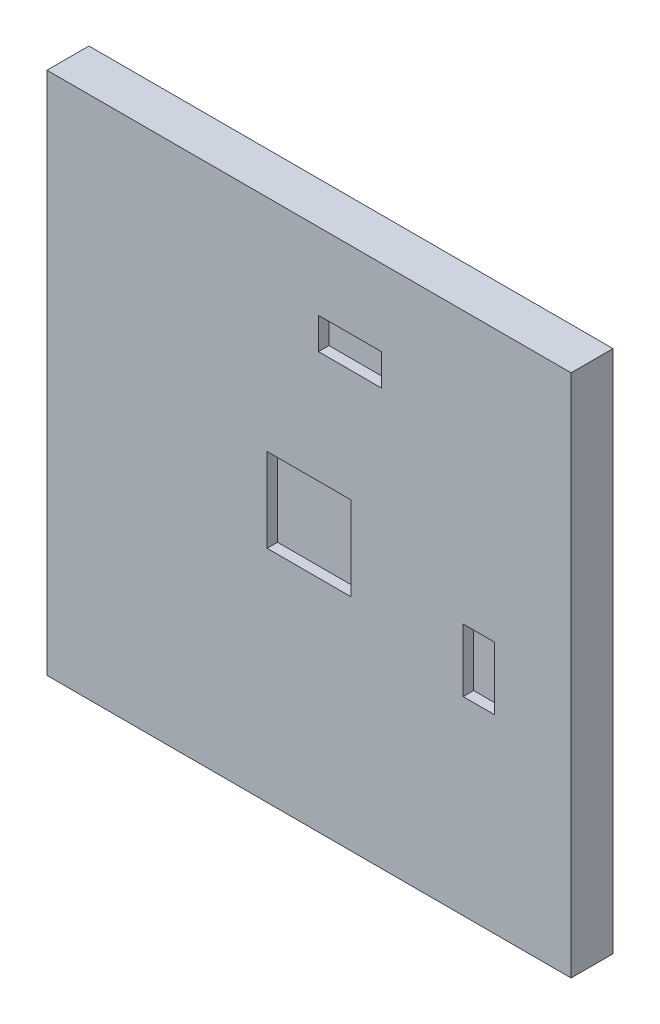
ISO-10303-21;
HEADER;
FILE_DESCRIPTION(('STEP AP214'),'2;1');
FILE_NAME('part.step','',(''),(''),'','','');
FILE_SCHEMA(('AUTOMOTIVE_DESIGN { 1 0 10303 214 1 1 1 1 }'));
ENDSEC;
DATA;
#1=APPLICATION_CONTEXT('core data for automotive mechanical design processes');
#2=APPLICATION_PROTOCOL_DEFINITION('international standard','automotive_design',2000,#1);
#3=PRODUCT_CONTEXT('',#1,'mechanical');
#4=PRODUCT('Part','Part','',(#3));
#5=PRODUCT_RELATED_PRODUCT_CATEGORY('part','',(#4));
#6=PRODUCT_DEFINITION_FORMATION('','',#4);
#7=PRODUCT_DEFINITION_CONTEXT('part definition',#1,'design');
#8=PRODUCT_DEFINITION('design','',#6,#7);
#9=PRODUCT_DEFINITION_SHAPE('','',#8);
#10=(LENGTH_UNIT() NAMED_UNIT(*) SI_UNIT(.MILLI.,.METRE.));
#11=(NAMED_UNIT(*) PLANE_ANGLE_UNIT() SI_UNIT($,.RADIAN.));
#12=(NAMED_UNIT(*) SI_UNIT($,.STERADIAN.) SOLID_ANGLE_UNIT());
#13=UNCERTAINTY_MEASURE_WITH_UNIT(LENGTH_MEASURE(1.E-05),#10,'distance_accuracy_value','');
#14=(GEOMETRIC_REPRESENTATION_CONTEXT(3) GLOBAL_UNCERTAINTY_ASSIGNED_CONTEXT((#13)) GLOBAL_UNIT_ASSIGNED_CONTEXT((#10,
#11,#12)) REPRESENTATION_CONTEXT('',''));
#15=CARTESIAN_POINT('',(0.,0.,0.));
#16=DIRECTION('',(0.,0.,1.));
#17=DIRECTION('',(1.,0.,0.));
#18=AXIS2_PLACEMENT_3D('',#15,#16,#17);
#19=CARTESIAN_POINT('',(0.,0.,20.));
#20=DIRECTION('',(0.,0.,1.));
#21=DIRECTION('',(1.,0.,0.));
#22=AXIS2_PLACEMENT_3D('',#19,#20,#21);
#23=PLANE('',#22);
#24=DIRECTION('',(-1.,0.,0.));
#25=VECTOR('',#24,1.);
#26=CARTESIAN_POINT('',(0.,17.5962921348315,20.));
#27=LINE('',#26,#25);
#28=CARTESIAN_POINT('',(56.5484076024617,17.5962921348315,20.));
#29=VERTEX_POINT('',#28);
#30=CARTESIAN_POINT('',(26.5484076024617,17.5962921348315,20.));
#31=VERTEX_POINT('',#30);
#32=EDGE_CURVE('E262',#29,#31,#27,.T.);
#33=ORIENTED_EDGE('',*,*,#32,.F.);
#34=DIRECTION('',(0.,-1.,0.));
#35=VECTOR('',#34,1.);
#36=CARTESIAN_POINT('',(56.5484076024617,0.,20.));
#37=LINE('',#36,#35);
#38=CARTESIAN_POINT('',(56.5484076024617,2.59629213483149,20.));
#39=VERTEX_POINT('',#38);
#40=EDGE_CURVE('E251',#29,#39,#37,.T.);
#41=ORIENTED_EDGE('',*,*,#40,.T.);
#42=DIRECTION('',(-1.,0.,0.));
#43=VECTOR('',#42,1.);
#44=CARTESIAN_POINT('',(0.,2.59629213483149,20.));
#45=LINE('',#44,#43);
#46=CARTESIAN_POINT('',(26.5484076024617,2.59629213483149,20.));
#47=VERTEX_POINT('',#46);
#48=EDGE_CURVE('E269',#39,#47,#45,.T.);
#49=ORIENTED_EDGE('',*,*,#48,.T.);
#50=DIRECTION('',(0.,-1.,0.));
#51=VECTOR('',#50,1.);
#52=CARTESIAN_POINT('',(26.5484076024617,0.,20.));
#53=LINE('',#52,#51);
#54=EDGE_CURVE('E265',#31,#47,#53,.T.);
#55=ORIENTED_EDGE('',*,*,#54,.F.);
#56=EDGE_LOOP('',(#33,#41,#49,#55));
#57=FACE_BOUND('',#56,.T.);
#58=DIRECTION('',(0.,1.,0.));
#59=VECTOR('',#58,1.);
#60=CARTESIAN_POINT('',(147.048407602462,-195.903707865169,20.));
#61=LINE('',#60,#59);
#62=CARTESIAN_POINT('',(147.048407602462,-195.903707865169,20.));
#63=VERTEX_POINT('',#62);
#64=CARTESIAN_POINT('',(147.048407602462,54.0962921348315,20.));
#65=VERTEX_POINT('',#64);
#66=EDGE_CURVE('E287',#63,#65,#61,.T.);
#67=ORIENTED_EDGE('',*,*,#66,.T.);
#68=DIRECTION('',(-1.,0.,0.));
#69=VECTOR('',#68,1.);
#70=CARTESIAN_POINT('',(147.048407602462,54.0962921348315,20.));
#71=LINE('',#70,#69);
#72=CARTESIAN_POINT('',(-102.951592397538,54.0962921348315,20.));
#73=VERTEX_POINT('',#72);
#74=EDGE_CURVE('E291',#65,#73,#71,.T.);
#75=ORIENTED_EDGE('',*,*,#74,.T.);
#76=DIRECTION('',(0.,-1.,0.));
#77=VECTOR('',#76,1.);
#78=CARTESIAN_POINT('',(-102.951592397538,-195.903707865169,20.));
#79=LINE('',#78,#77);
#80=CARTESIAN_POINT('',(-102.951592397538,-195.903707865169,20.));
#81=VERTEX_POINT('',#80);
#82=EDGE_CURVE('E295',#73,#81,#79,.T.);
#83=ORIENTED_EDGE('',*,*,#82,.T.);
#84=DIRECTION('',(1.,0.,0.));
#85=VECTOR('',#84,1.);
#86=CARTESIAN_POINT('',(147.048407602462,-195.903707865169,20.));
#87=LINE('',#86,#85);
#88=EDGE_CURVE('E298',#81,#63,#87,.T.);
#89=ORIENTED_EDGE('',*,*,#88,.T.);
#90=EDGE_LOOP('',(#67,#75,#83,#89));
#91=FACE_BOUND('',#90,.T.);
#92=DIRECTION('',(1.,0.,0.));
#93=VECTOR('',#92,1.);
#94=CARTESIAN_POINT('',(0.,-50.9037078651685,20.));
#95=LINE('',#94,#93);
#96=CARTESIAN_POINT('',(2.04840760246174,-50.9037078651685,20.));
#97=VERTEX_POINT('',#96);
#98=CARTESIAN_POINT('',(42.0484076024617,-50.9037078651685,20.));
#99=VERTEX_POINT('',#98);
#100=EDGE_CURVE('E224',#97,#99,#95,.T.);
#101=ORIENTED_EDGE('',*,*,#100,.T.);
#102=DIRECTION('',(0.,-1.,0.));
#103=VECTOR('',#102,1.);
#104=CARTESIAN_POINT('',(42.0484076024617,0.,20.));
#105=LINE('',#104,#103);
#106=CARTESIAN_POINT('',(42.0484076024617,-90.9037078651685,20.));
#107=VERTEX_POINT('',#106);
#108=EDGE_CURVE('E63',#99,#107,#105,.T.);
#109=ORIENTED_EDGE('',*,*,#108,.T.);
#110=DIRECTION('',(1.,0.,0.));
#111=VECTOR('',#110,1.);
#112=CARTESIAN_POINT('',(0.,-90.9037078651685,20.));
#113=LINE('',#112,#111);
#114=CARTESIAN_POINT('',(2.04840760246174,-90.9037078651685,20.));
#115=VERTEX_POINT('',#114);
#116=EDGE_CURVE('E210',#115,#107,#113,.T.);
#117=ORIENTED_EDGE('',*,*,#116,.F.);
#118=DIRECTION('',(0.,-1.,0.));
#119=VECTOR('',#118,1.);
#120=CARTESIAN_POINT('',(2.04840760246173,0.,20.));
#121=LINE('',#120,#119);
#122=EDGE_CURVE('E229',#97,#115,#121,.T.);
#123=ORIENTED_EDGE('',*,*,#122,.F.);
#124=EDGE_LOOP('',(#101,#109,#117,#123));
#125=FACE_BOUND('',#124,.T.);
#126=DIRECTION('',(-1.,0.,0.));
#127=VECTOR('',#126,1.);
#128=CARTESIAN_POINT('',(0.,-105.403707865169,20.));
#129=LINE('',#128,#127);
#130=CARTESIAN_POINT('',(110.548407602462,-105.403707865169,20.));
#131=VERTEX_POINT('',#130);
#132=CARTESIAN_POINT('',(95.5484076024617,-105.403707865169,20.));
#133=VERTEX_POINT('',#132);
#134=EDGE_CURVE('E190',#131,#133,#129,.T.);
#135=ORIENTED_EDGE('',*,*,#134,.T.);
#136=DIRECTION('',(0.,1.,0.));
#137=VECTOR('',#136,1.);
#138=CARTESIAN_POINT('',(95.5484076024617,0.,20.));
#139=LINE('',#138,#137);
#140=CARTESIAN_POINT('',(95.5484076024617,-75.4037078651685,20.));
#141=VERTEX_POINT('',#140);
#142=EDGE_CURVE('E55',#133,#141,#139,.T.);
#143=ORIENTED_EDGE('',*,*,#142,.T.);
#144=DIRECTION('',(-1.,0.,0.));
#145=VECTOR('',#144,1.);
#146=CARTESIAN_POINT('',(0.,-75.4037078651685,20.));
#147=LINE('',#146,#145);
#148=CARTESIAN_POINT('',(110.548407602462,-75.4037078651685,20.));
#149=VERTEX_POINT('',#148);
#150=EDGE_CURVE('E177',#149,#141,#147,.T.);
#151=ORIENTED_EDGE('',*,*,#150,.F.);
#152=DIRECTION('',(0.,1.,0.));
#153=VECTOR('',#152,1.);
#154=CARTESIAN_POINT('',(110.548407602462,0.,20.));
#155=LINE('',#154,#153);
#156=EDGE_CURVE('E181',#131,#149,#155,.T.);
#157=ORIENTED_EDGE('',*,*,#156,.F.);
#158=EDGE_LOOP('',(#135,#143,#151,#157));
#159=FACE_BOUND('',#158,.T.);
#160=ADVANCED_FACE('F39',(#57,#91,#125,#159),#23,.T.);
#161=CARTESIAN_POINT('',(147.048407602462,-195.903707865169,20.));
#162=DIRECTION('',(-1.,0.,0.));
#163=DIRECTION('',(0.,0.,1.));
#164=AXIS2_PLACEMENT_3D('',#161,#162,#163);
#165=PLANE('',#164);
#166=DIRECTION('',(0.,1.,0.));
#167=VECTOR('',#166,1.);
#168=CARTESIAN_POINT('',(147.048407602462,-195.903707865169,0.));
#169=LINE('',#168,#167);
#170=CARTESIAN_POINT('',(147.048407602462,-195.903707865169,0.));
#171=VERTEX_POINT('',#170);
#172=CARTESIAN_POINT('',(147.048407602462,54.0962921348315,0.));
#173=VERTEX_POINT('',#172);
#174=EDGE_CURVE('E200',#171,#173,#169,.T.);
#175=ORIENTED_EDGE('',*,*,#174,.T.);
#176=DIRECTION('',(0.,0.,-1.));
#177=VECTOR('',#176,1.);
#178=CARTESIAN_POINT('',(147.048407602462,54.0962921348315,20.));
#179=LINE('',#178,#177);
#180=EDGE_CURVE('E11',#65,#173,#179,.T.);
#181=ORIENTED_EDGE('',*,*,#180,.F.);
#182=ORIENTED_EDGE('',*,*,#66,.F.);
#183=DIRECTION('',(0.,0.,-1.));
#184=VECTOR('',#183,1.);
#185=CARTESIAN_POINT('',(147.048407602462,-195.903707865169,20.));
#186=LINE('',#185,#184);
#187=EDGE_CURVE('E301',#63,#171,#186,.T.);
#188=ORIENTED_EDGE('',*,*,#187,.T.);
#189=EDGE_LOOP('',(#175,#181,#182,#188));
#190=FACE_BOUND('',#189,.T.);
#191=ADVANCED_FACE('F41',(#190),#165,.F.);
#192=CARTESIAN_POINT('',(147.048407602462,54.0962921348315,20.));
#193=DIRECTION('',(0.,-1.,0.));
#194=DIRECTION('',(1.,0.,0.));
#195=AXIS2_PLACEMENT_3D('',#192,#193,#194);
#196=PLANE('',#195);
#197=DIRECTION('',(-1.,0.,0.));
#198=VECTOR('',#197,1.);
#199=CARTESIAN_POINT('',(147.048407602462,54.0962921348315,0.));
#200=LINE('',#199,#198);
#201=CARTESIAN_POINT('',(-102.951592397538,54.0962921348315,0.));
#202=VERTEX_POINT('',#201);
#203=EDGE_CURVE('E305',#173,#202,#200,.T.);
#204=ORIENTED_EDGE('',*,*,#203,.T.);
#205=DIRECTION('',(0.,0.,-1.));
#206=VECTOR('',#205,1.);
#207=CARTESIAN_POINT('',(-102.951592397538,54.0962921348315,20.));
#208=LINE('',#207,#206);
#209=EDGE_CURVE('E48',#73,#202,#208,.T.);
#210=ORIENTED_EDGE('',*,*,#209,.F.);
#211=ORIENTED_EDGE('',*,*,#74,.F.);
#212=ORIENTED_EDGE('',*,*,#180,.T.);
#213=EDGE_LOOP('',(#204,#210,#211,#212));
#214=FACE_BOUND('',#213,.T.);
#215=ADVANCED_FACE('F341',(#214),#196,.F.);
#216=CARTESIAN_POINT('',(-102.951592397538,-195.903707865169,20.));
#217=DIRECTION('',(1.,0.,0.));
#218=DIRECTION('',(0.,0.,-1.));
#219=AXIS2_PLACEMENT_3D('',#216,#217,#218);
#220=PLANE('',#219);
#221=DIRECTION('',(0.,-1.,0.));
#222=VECTOR('',#221,1.);
#223=CARTESIAN_POINT('',(-102.951592397538,-195.903707865169,0.));
#224=LINE('',#223,#222);
#225=CARTESIAN_POINT('',(-102.951592397538,-195.903707865169,0.));
#226=VERTEX_POINT('',#225);
#227=EDGE_CURVE('E308',#202,#226,#224,.T.);
#228=ORIENTED_EDGE('',*,*,#227,.T.);
#229=DIRECTION('',(0.,0.,-1.));
#230=VECTOR('',#229,1.);
#231=CARTESIAN_POINT('',(-102.951592397538,-195.903707865169,20.));
#232=LINE('',#231,#230);
#233=EDGE_CURVE('E316',#81,#226,#232,.T.);
#234=ORIENTED_EDGE('',*,*,#233,.F.);
#235=ORIENTED_EDGE('',*,*,#82,.F.);
#236=ORIENTED_EDGE('',*,*,#209,.T.);
#237=EDGE_LOOP('',(#228,#234,#235,#236));
#238=FACE_BOUND('',#237,.T.);
#239=ADVANCED_FACE('F325',(#238),#220,.F.);
#240=CARTESIAN_POINT('',(147.048407602462,-195.903707865169,20.));
#241=DIRECTION('',(0.,1.,0.));
#242=DIRECTION('',(-1.,0.,0.));
#243=AXIS2_PLACEMENT_3D('',#240,#241,#242);
#244=PLANE('',#243);
#245=DIRECTION('',(1.,0.,0.));
#246=VECTOR('',#245,1.);
#247=CARTESIAN_POINT('',(147.048407602462,-195.903707865169,0.));
#248=LINE('',#247,#246);
#249=EDGE_CURVE('E292',#226,#171,#248,.T.);
#250=ORIENTED_EDGE('',*,*,#249,.T.);
#251=ORIENTED_EDGE('',*,*,#187,.F.);
#252=ORIENTED_EDGE('',*,*,#88,.F.);
#253=ORIENTED_EDGE('',*,*,#233,.T.);
#254=EDGE_LOOP('',(#250,#251,#252,#253));
#255=FACE_BOUND('',#254,.T.);
#256=ADVANCED_FACE('F334',(#255),#244,.F.);
#257=CARTESIAN_POINT('',(0.,0.,0.));
#258=DIRECTION('',(0.,0.,1.));
#259=DIRECTION('',(1.,0.,0.));
#260=AXIS2_PLACEMENT_3D('',#257,#258,#259);
#261=PLANE('',#260);
#262=ORIENTED_EDGE('',*,*,#174,.F.);
#263=ORIENTED_EDGE('',*,*,#249,.F.);
#264=ORIENTED_EDGE('',*,*,#227,.F.);
#265=ORIENTED_EDGE('',*,*,#203,.F.);
#266=EDGE_LOOP('',(#262,#263,#264,#265));
#267=FACE_BOUND('',#266,.T.);
#268=ADVANCED_FACE('F331',(#267),#261,.F.);
#269=CARTESIAN_POINT('',(0.,17.5962921348315,15.));
#270=DIRECTION('',(0.,1.,0.));
#271=DIRECTION('',(-1.,0.,0.));
#272=AXIS2_PLACEMENT_3D('',#269,#270,#271);
#273=PLANE('',#272);
#274=ORIENTED_EDGE('',*,*,#32,.T.);
#275=DIRECTION('',(0.,0.,1.));
#276=VECTOR('',#275,1.);
#277=CARTESIAN_POINT('',(26.5484076024617,17.5962921348315,15.));
#278=LINE('',#277,#276);
#279=CARTESIAN_POINT('',(26.5484076024617,17.5962921348315,15.));
#280=VERTEX_POINT('',#279);
#281=EDGE_CURVE('E261',#280,#31,#278,.T.);
#282=ORIENTED_EDGE('',*,*,#281,.F.);
#283=DIRECTION('',(-1.,0.,0.));
#284=VECTOR('',#283,1.);
#285=CARTESIAN_POINT('',(0.,17.5962921348315,15.));
#286=LINE('',#285,#284);
#287=CARTESIAN_POINT('',(56.5484076024617,17.5962921348315,15.));
#288=VERTEX_POINT('',#287);
#289=EDGE_CURVE('E246',#288,#280,#286,.T.);
#290=ORIENTED_EDGE('',*,*,#289,.F.);
#291=DIRECTION('',(0.,0.,1.));
#292=VECTOR('',#291,1.);
#293=CARTESIAN_POINT('',(56.5484076024617,17.5962921348315,15.));
#294=LINE('',#293,#292);
#295=EDGE_CURVE('E225',#288,#29,#294,.T.);
#296=ORIENTED_EDGE('',*,*,#295,.T.);
#297=EDGE_LOOP('',(#274,#282,#290,#296));
#298=FACE_BOUND('',#297,.T.);
#299=ADVANCED_FACE('F356',(#298),#273,.F.);
#300=CARTESIAN_POINT('',(56.5484076024617,0.,15.));
#301=DIRECTION('',(-1.,0.,0.));
#302=DIRECTION('',(0.,0.,1.));
#303=AXIS2_PLACEMENT_3D('',#300,#301,#302);
#304=PLANE('',#303);
#305=ORIENTED_EDGE('',*,*,#40,.F.);
#306=ORIENTED_EDGE('',*,*,#295,.F.);
#307=DIRECTION('',(0.,-1.,0.));
#308=VECTOR('',#307,1.);
#309=CARTESIAN_POINT('',(56.5484076024617,0.,15.));
#310=LINE('',#309,#308);
#311=CARTESIAN_POINT('',(56.5484076024617,2.59629213483149,15.));
#312=VERTEX_POINT('',#311);
#313=EDGE_CURVE('E258',#288,#312,#310,.T.);
#314=ORIENTED_EDGE('',*,*,#313,.T.);
#315=DIRECTION('',(0.,0.,1.));
#316=VECTOR('',#315,1.);
#317=CARTESIAN_POINT('',(56.5484076024617,2.59629213483149,15.));
#318=LINE('',#317,#316);
#319=EDGE_CURVE('E278',#312,#39,#318,.T.);
#320=ORIENTED_EDGE('',*,*,#319,.T.);
#321=EDGE_LOOP('',(#305,#306,#314,#320));
#322=FACE_BOUND('',#321,.T.);
#323=ADVANCED_FACE('F375',(#322),#304,.T.);
#324=CARTESIAN_POINT('',(0.,2.59629213483149,15.));
#325=DIRECTION('',(0.,1.,0.));
#326=DIRECTION('',(-1.,0.,0.));
#327=AXIS2_PLACEMENT_3D('',#324,#325,#326);
#328=PLANE('',#327);
#329=ORIENTED_EDGE('',*,*,#48,.F.);
#330=ORIENTED_EDGE('',*,*,#319,.F.);
#331=DIRECTION('',(-1.,0.,0.));
#332=VECTOR('',#331,1.);
#333=CARTESIAN_POINT('',(0.,2.59629213483149,15.));
#334=LINE('',#333,#332);
#335=CARTESIAN_POINT('',(26.5484076024617,2.59629213483149,15.));
#336=VERTEX_POINT('',#335);
#337=EDGE_CURVE('E255',#312,#336,#334,.T.);
#338=ORIENTED_EDGE('',*,*,#337,.T.);
#339=DIRECTION('',(0.,0.,1.));
#340=VECTOR('',#339,1.);
#341=CARTESIAN_POINT('',(26.5484076024617,2.59629213483149,15.));
#342=LINE('',#341,#340);
#343=EDGE_CURVE('E281',#336,#47,#342,.T.);
#344=ORIENTED_EDGE('',*,*,#343,.T.);
#345=EDGE_LOOP('',(#329,#330,#338,#344));
#346=FACE_BOUND('',#345,.T.);
#347=ADVANCED_FACE('F382',(#346),#328,.T.);
#348=CARTESIAN_POINT('',(26.5484076024617,0.,15.));
#349=DIRECTION('',(-1.,0.,0.));
#350=DIRECTION('',(0.,-1.,0.));
#351=AXIS2_PLACEMENT_3D('',#348,#349,#350);
#352=PLANE('',#351);
#353=ORIENTED_EDGE('',*,*,#54,.T.);
#354=ORIENTED_EDGE('',*,*,#343,.F.);
#355=DIRECTION('',(0.,-1.,0.));
#356=VECTOR('',#355,1.);
#357=CARTESIAN_POINT('',(26.5484076024617,0.,15.));
#358=LINE('',#357,#356);
#359=EDGE_CURVE('E250',#280,#336,#358,.T.);
#360=ORIENTED_EDGE('',*,*,#359,.F.);
#361=ORIENTED_EDGE('',*,*,#281,.T.);
#362=EDGE_LOOP('',(#353,#354,#360,#361));
#363=FACE_BOUND('',#362,.T.);
#364=ADVANCED_FACE('F390',(#363),#352,.F.);
#365=CARTESIAN_POINT('',(0.,0.,15.));
#366=DIRECTION('',(0.,0.,1.));
#367=DIRECTION('',(1.,0.,0.));
#368=AXIS2_PLACEMENT_3D('',#365,#366,#367);
#369=PLANE('',#368);
#370=ORIENTED_EDGE('',*,*,#289,.T.);
#371=ORIENTED_EDGE('',*,*,#359,.T.);
#372=ORIENTED_EDGE('',*,*,#337,.F.);
#373=ORIENTED_EDGE('',*,*,#313,.F.);
#374=EDGE_LOOP('',(#370,#371,#372,#373));
#375=FACE_BOUND('',#374,.T.);
#376=ADVANCED_FACE('F398',(#375),#369,.T.);
#377=CARTESIAN_POINT('',(42.0484076024617,0.,15.));
#378=DIRECTION('',(-1.,0.,0.));
#379=DIRECTION('',(0.,-1.,0.));
#380=AXIS2_PLACEMENT_3D('',#377,#378,#379);
#381=PLANE('',#380);
#382=ORIENTED_EDGE('',*,*,#108,.F.);
#383=DIRECTION('',(0.,0.,1.));
#384=VECTOR('',#383,1.);
#385=CARTESIAN_POINT('',(42.0484076024617,-50.9037078651685,15.));
#386=LINE('',#385,#384);
#387=CARTESIAN_POINT('',(42.0484076024617,-50.9037078651685,15.));
#388=VERTEX_POINT('',#387);
#389=EDGE_CURVE('E221',#388,#99,#386,.T.);
#390=ORIENTED_EDGE('',*,*,#389,.F.);
#391=DIRECTION('',(0.,-1.,0.));
#392=VECTOR('',#391,1.);
#393=CARTESIAN_POINT('',(42.0484076024617,0.,15.));
#394=LINE('',#393,#392);
#395=CARTESIAN_POINT('',(42.0484076024617,-90.9037078651685,15.));
#396=VERTEX_POINT('',#395);
#397=EDGE_CURVE('E206',#388,#396,#394,.T.);
#398=ORIENTED_EDGE('',*,*,#397,.T.);
#399=DIRECTION('',(0.,0.,1.));
#400=VECTOR('',#399,1.);
#401=CARTESIAN_POINT('',(42.0484076024617,-90.9037078651685,15.));
#402=LINE('',#401,#400);
#403=EDGE_CURVE('E191',#396,#107,#402,.T.);
#404=ORIENTED_EDGE('',*,*,#403,.T.);
#405=EDGE_LOOP('',(#382,#390,#398,#404));
#406=FACE_BOUND('',#405,.T.);
#407=ADVANCED_FACE('F405',(#406),#381,.T.);
#408=CARTESIAN_POINT('',(0.,-90.9037078651685,15.));
#409=DIRECTION('',(0.,-1.,0.));
#410=DIRECTION('',(0.,0.,-1.));
#411=AXIS2_PLACEMENT_3D('',#408,#409,#410);
#412=PLANE('',#411);
#413=ORIENTED_EDGE('',*,*,#116,.T.);
#414=ORIENTED_EDGE('',*,*,#403,.F.);
#415=DIRECTION('',(1.,0.,0.));
#416=VECTOR('',#415,1.);
#417=CARTESIAN_POINT('',(0.,-90.9037078651685,15.));
#418=LINE('',#417,#416);
#419=CARTESIAN_POINT('',(2.04840760246174,-90.9037078651685,15.));
#420=VERTEX_POINT('',#419);
#421=EDGE_CURVE('E217',#420,#396,#418,.T.);
#422=ORIENTED_EDGE('',*,*,#421,.F.);
#423=DIRECTION('',(0.,0.,1.));
#424=VECTOR('',#423,1.);
#425=CARTESIAN_POINT('',(2.04840760246174,-90.9037078651685,15.));
#426=LINE('',#425,#424);
#427=EDGE_CURVE('E238',#420,#115,#426,.T.);
#428=ORIENTED_EDGE('',*,*,#427,.T.);
#429=EDGE_LOOP('',(#413,#414,#422,#428));
#430=FACE_BOUND('',#429,.T.);
#431=ADVANCED_FACE('F413',(#430),#412,.F.);
#432=CARTESIAN_POINT('',(2.04840760246173,0.,15.));
#433=DIRECTION('',(-1.,0.,0.));
#434=DIRECTION('',(0.,-1.,0.));
#435=AXIS2_PLACEMENT_3D('',#432,#433,#434);
#436=PLANE('',#435);
#437=ORIENTED_EDGE('',*,*,#122,.T.);
#438=ORIENTED_EDGE('',*,*,#427,.F.);
#439=DIRECTION('',(0.,-1.,0.));
#440=VECTOR('',#439,1.);
#441=CARTESIAN_POINT('',(2.04840760246173,0.,15.));
#442=LINE('',#441,#440);
#443=CARTESIAN_POINT('',(2.04840760246174,-50.9037078651685,15.));
#444=VERTEX_POINT('',#443);
#445=EDGE_CURVE('E213',#444,#420,#442,.T.);
#446=ORIENTED_EDGE('',*,*,#445,.F.);
#447=DIRECTION('',(0.,0.,1.));
#448=VECTOR('',#447,1.);
#449=CARTESIAN_POINT('',(2.04840760246174,-50.9037078651685,15.));
#450=LINE('',#449,#448);
#451=EDGE_CURVE('E241',#444,#97,#450,.T.);
#452=ORIENTED_EDGE('',*,*,#451,.T.);
#453=EDGE_LOOP('',(#437,#438,#446,#452));
#454=FACE_BOUND('',#453,.T.);
#455=ADVANCED_FACE('F420',(#454),#436,.F.);
#456=CARTESIAN_POINT('',(0.,-50.9037078651685,15.));
#457=DIRECTION('',(0.,-1.,0.));
#458=DIRECTION('',(0.,0.,-1.));
#459=AXIS2_PLACEMENT_3D('',#456,#457,#458);
#460=PLANE('',#459);
#461=ORIENTED_EDGE('',*,*,#100,.F.);
#462=ORIENTED_EDGE('',*,*,#451,.F.);
#463=DIRECTION('',(1.,0.,0.));
#464=VECTOR('',#463,1.);
#465=CARTESIAN_POINT('',(0.,-50.9037078651685,15.));
#466=LINE('',#465,#464);
#467=EDGE_CURVE('E209',#444,#388,#466,.T.);
#468=ORIENTED_EDGE('',*,*,#467,.T.);
#469=ORIENTED_EDGE('',*,*,#389,.T.);
#470=EDGE_LOOP('',(#461,#462,#468,#469));
#471=FACE_BOUND('',#470,.T.);
#472=ADVANCED_FACE('F428',(#471),#460,.T.);
#473=CARTESIAN_POINT('',(0.,0.,15.));
#474=DIRECTION('',(0.,0.,1.));
#475=DIRECTION('',(1.,0.,0.));
#476=AXIS2_PLACEMENT_3D('',#473,#474,#475);
#477=PLANE('',#476);
#478=ORIENTED_EDGE('',*,*,#397,.F.);
#479=ORIENTED_EDGE('',*,*,#467,.F.);
#480=ORIENTED_EDGE('',*,*,#445,.T.);
#481=ORIENTED_EDGE('',*,*,#421,.T.);
#482=EDGE_LOOP('',(#478,#479,#480,#481));
#483=FACE_BOUND('',#482,.T.);
#484=ADVANCED_FACE('F436',(#483),#477,.T.);
#485=CARTESIAN_POINT('',(95.5484076024617,0.,15.));
#486=DIRECTION('',(1.,0.,0.));
#487=DIRECTION('',(0.,0.,-1.));
#488=AXIS2_PLACEMENT_3D('',#485,#486,#487);
#489=PLANE('',#488);
#490=ORIENTED_EDGE('',*,*,#142,.F.);
#491=DIRECTION('',(0.,0.,1.));
#492=VECTOR('',#491,1.);
#493=CARTESIAN_POINT('',(95.5484076024617,-105.403707865169,15.));
#494=LINE('',#493,#492);
#495=CARTESIAN_POINT('',(95.5484076024617,-105.403707865169,15.));
#496=VERTEX_POINT('',#495);
#497=EDGE_CURVE('E157',#496,#133,#494,.T.);
#498=ORIENTED_EDGE('',*,*,#497,.F.);
#499=DIRECTION('',(0.,1.,0.));
#500=VECTOR('',#499,1.);
#501=CARTESIAN_POINT('',(95.5484076024617,0.,15.));
#502=LINE('',#501,#500);
#503=CARTESIAN_POINT('',(95.5484076024617,-75.4037078651685,15.));
#504=VERTEX_POINT('',#503);
#505=EDGE_CURVE('E166',#496,#504,#502,.T.);
#506=ORIENTED_EDGE('',*,*,#505,.T.);
#507=DIRECTION('',(0.,0.,1.));
#508=VECTOR('',#507,1.);
#509=CARTESIAN_POINT('',(95.5484076024617,-75.4037078651685,15.));
#510=LINE('',#509,#508);
#511=EDGE_CURVE('E197',#504,#141,#510,.T.);
#512=ORIENTED_EDGE('',*,*,#511,.T.);
#513=EDGE_LOOP('',(#490,#498,#506,#512));
#514=FACE_BOUND('',#513,.T.);
#515=ADVANCED_FACE('F168',(#514),#489,.T.);
#516=CARTESIAN_POINT('',(0.,-75.4037078651685,15.));
#517=DIRECTION('',(0.,1.,0.));
#518=DIRECTION('',(0.,0.,1.));
#519=AXIS2_PLACEMENT_3D('',#516,#517,#518);
#520=PLANE('',#519);
#521=ORIENTED_EDGE('',*,*,#150,.T.);
#522=ORIENTED_EDGE('',*,*,#511,.F.);
#523=DIRECTION('',(-1.,0.,0.));
#524=VECTOR('',#523,1.);
#525=CARTESIAN_POINT('',(0.,-75.4037078651685,15.));
#526=LINE('',#525,#524);
#527=CARTESIAN_POINT('',(110.548407602462,-75.4037078651685,15.));
#528=VERTEX_POINT('',#527);
#529=EDGE_CURVE('E171',#528,#504,#526,.T.);
#530=ORIENTED_EDGE('',*,*,#529,.F.);
#531=DIRECTION('',(0.,0.,1.));
#532=VECTOR('',#531,1.);
#533=CARTESIAN_POINT('',(110.548407602462,-75.4037078651685,15.));
#534=LINE('',#533,#532);
#535=EDGE_CURVE('E201',#528,#149,#534,.T.);
#536=ORIENTED_EDGE('',*,*,#535,.T.);
#537=EDGE_LOOP('',(#521,#522,#530,#536));
#538=FACE_BOUND('',#537,.T.);
#539=ADVANCED_FACE('F451',(#538),#520,.F.);
#540=CARTESIAN_POINT('',(110.548407602462,0.,15.));
#541=DIRECTION('',(1.,0.,0.));
#542=DIRECTION('',(0.,0.,-1.));
#543=AXIS2_PLACEMENT_3D('',#540,#541,#542);
#544=PLANE('',#543);
#545=ORIENTED_EDGE('',*,*,#156,.T.);
#546=ORIENTED_EDGE('',*,*,#535,.F.);
#547=DIRECTION('',(0.,1.,0.));
#548=VECTOR('',#547,1.);
#549=CARTESIAN_POINT('',(110.548407602462,0.,15.));
#550=LINE('',#549,#548);
#551=CARTESIAN_POINT('',(110.548407602462,-105.403707865169,15.));
#552=VERTEX_POINT('',#551);
#553=EDGE_CURVE('E165',#552,#528,#550,.T.);
#554=ORIENTED_EDGE('',*,*,#553,.F.);
#555=DIRECTION('',(0.,0.,1.));
#556=VECTOR('',#555,1.);
#557=CARTESIAN_POINT('',(110.548407602462,-105.403707865169,15.));
#558=LINE('',#557,#556);
#559=EDGE_CURVE('E159',#552,#131,#558,.T.);
#560=ORIENTED_EDGE('',*,*,#559,.T.);
#561=EDGE_LOOP('',(#545,#546,#554,#560));
#562=FACE_BOUND('',#561,.T.);
#563=ADVANCED_FACE('F458',(#562),#544,.F.);
#564=CARTESIAN_POINT('',(0.,-105.403707865169,15.));
#565=DIRECTION('',(0.,1.,0.));
#566=DIRECTION('',(0.,0.,1.));
#567=AXIS2_PLACEMENT_3D('',#564,#565,#566);
#568=PLANE('',#567);
#569=ORIENTED_EDGE('',*,*,#134,.F.);
#570=ORIENTED_EDGE('',*,*,#559,.F.);
#571=DIRECTION('',(-1.,0.,0.));
#572=VECTOR('',#571,1.);
#573=CARTESIAN_POINT('',(0.,-105.403707865169,15.));
#574=LINE('',#573,#572);
#575=EDGE_CURVE('E154',#552,#496,#574,.T.);
#576=ORIENTED_EDGE('',*,*,#575,.T.);
#577=ORIENTED_EDGE('',*,*,#497,.T.);
#578=EDGE_LOOP('',(#569,#570,#576,#577));
#579=FACE_BOUND('',#578,.T.);
#580=ADVANCED_FACE('F156',(#579),#568,.T.);
#581=CARTESIAN_POINT('',(0.,0.,15.));
#582=DIRECTION('',(0.,0.,1.));
#583=DIRECTION('',(1.,0.,0.));
#584=AXIS2_PLACEMENT_3D('',#581,#582,#583);
#585=PLANE('',#584);
#586=ORIENTED_EDGE('',*,*,#505,.F.);
#587=ORIENTED_EDGE('',*,*,#575,.F.);
#588=ORIENTED_EDGE('',*,*,#553,.T.);
#589=ORIENTED_EDGE('',*,*,#529,.T.);
#590=EDGE_LOOP('',(#586,#587,#588,#589));
#591=FACE_BOUND('',#590,.T.);
#592=ADVANCED_FACE('F174',(#591),#585,.T.);
#593=CLOSED_SHELL('',(#160,#191,#215,#239,#256,#268,#299,#323,#347,#364,#376,#407,#431,#455,
#472,#484,#515,#539,#563,#580,#592));
#594=MANIFOLD_SOLID_BREP('B2',#593);
#595=ADVANCED_BREP_SHAPE_REPRESENTATION('',(#18,#594),#14);
#596=SHAPE_DEFINITION_REPRESENTATION(#9,#595);
ENDSEC;
END-ISO-10303-21;
